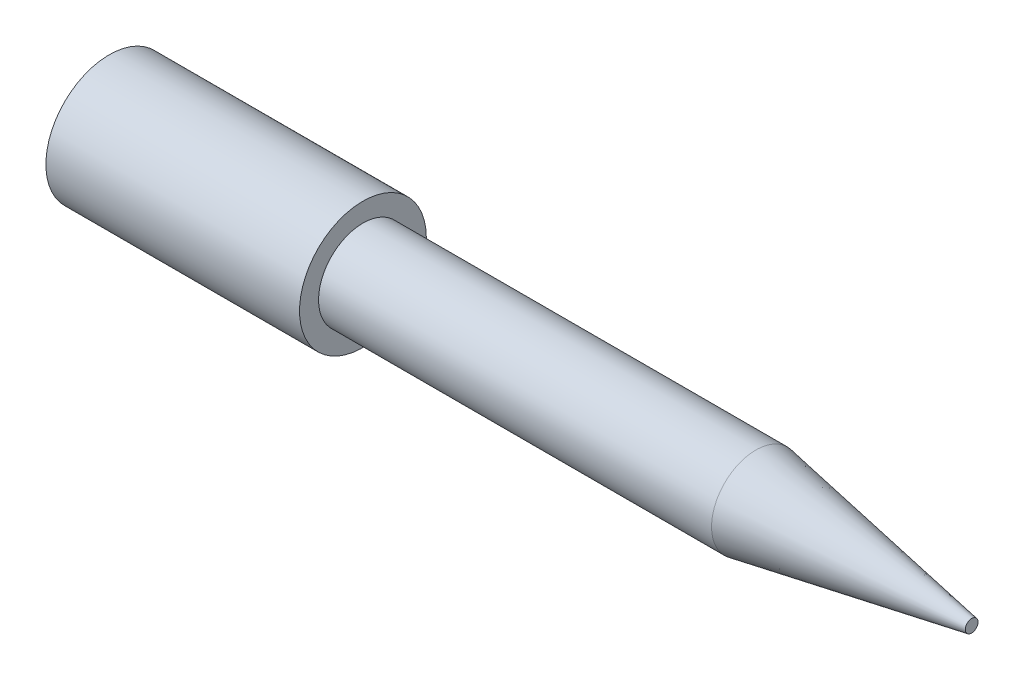
ISO-10303-21;
HEADER;
FILE_DESCRIPTION(('STEP AP214'),'2;1');
FILE_NAME('part.step','',(''),(''),'','','');
FILE_SCHEMA(('AUTOMOTIVE_DESIGN { 1 0 10303 214 1 1 1 1 }'));
ENDSEC;
DATA;
#1=APPLICATION_CONTEXT('core data for automotive mechanical design processes');
#2=APPLICATION_PROTOCOL_DEFINITION('international standard','automotive_design',2000,#1);
#3=PRODUCT_CONTEXT('',#1,'mechanical');
#4=PRODUCT('Part','Part','',(#3));
#5=PRODUCT_RELATED_PRODUCT_CATEGORY('part','',(#4));
#6=PRODUCT_DEFINITION_FORMATION('','',#4);
#7=PRODUCT_DEFINITION_CONTEXT('part definition',#1,'design');
#8=PRODUCT_DEFINITION('design','',#6,#7);
#9=PRODUCT_DEFINITION_SHAPE('','',#8);
#10=(LENGTH_UNIT() NAMED_UNIT(*) SI_UNIT(.MILLI.,.METRE.));
#11=(NAMED_UNIT(*) PLANE_ANGLE_UNIT() SI_UNIT($,.RADIAN.));
#12=(NAMED_UNIT(*) SI_UNIT($,.STERADIAN.) SOLID_ANGLE_UNIT());
#13=UNCERTAINTY_MEASURE_WITH_UNIT(LENGTH_MEASURE(1.E-05),#10,'distance_accuracy_value','');
#14=(GEOMETRIC_REPRESENTATION_CONTEXT(3) GLOBAL_UNCERTAINTY_ASSIGNED_CONTEXT((#13)) GLOBAL_UNIT_ASSIGNED_CONTEXT((#10,
#11,#12)) REPRESENTATION_CONTEXT('',''));
#15=CARTESIAN_POINT('',(0.,0.,0.));
#16=DIRECTION('',(0.,0.,1.));
#17=DIRECTION('',(1.,0.,0.));
#18=AXIS2_PLACEMENT_3D('',#15,#16,#17);
#19=CARTESIAN_POINT('',(10.,0.,0.));
#20=DIRECTION('',(-1.,0.,0.));
#21=DIRECTION('',(0.,0.,1.));
#22=AXIS2_PLACEMENT_3D('',#19,#20,#21);
#23=CYLINDRICAL_SURFACE('',#22,2.5);
#24=CARTESIAN_POINT('',(10.,0.,0.));
#25=DIRECTION('',(1.,0.,0.));
#26=DIRECTION('',(0.,0.,-1.));
#27=AXIS2_PLACEMENT_3D('',#24,#25,#26);
#28=CIRCLE('',#27,2.5);
#29=CARTESIAN_POINT('',(10.,0.,-2.5));
#30=VERTEX_POINT('',#29);
#31=EDGE_CURVE('E51',#30,#30,#28,.T.);
#32=ORIENTED_EDGE('',*,*,#31,.F.);
#33=EDGE_LOOP('',(#32));
#34=FACE_BOUND('',#33,.T.);
#35=CARTESIAN_POINT('',(0.,0.,0.));
#36=DIRECTION('',(1.,0.,0.));
#37=DIRECTION('',(0.,0.,-1.));
#38=AXIS2_PLACEMENT_3D('',#35,#36,#37);
#39=CIRCLE('',#38,2.5);
#40=CARTESIAN_POINT('',(0.,0.,-2.5));
#41=VERTEX_POINT('',#40);
#42=EDGE_CURVE('E54',#41,#41,#39,.T.);
#43=ORIENTED_EDGE('',*,*,#42,.T.);
#44=EDGE_LOOP('',(#43));
#45=FACE_BOUND('',#44,.T.);
#46=ADVANCED_FACE('F35',(#34,#45),#23,.T.);
#47=CARTESIAN_POINT('',(10.,0.,0.));
#48=DIRECTION('',(1.,0.,0.));
#49=DIRECTION('',(0.,0.,-1.));
#50=AXIS2_PLACEMENT_3D('',#47,#48,#49);
#51=PLANE('',#50);
#52=CARTESIAN_POINT('',(10.,0.,0.));
#53=DIRECTION('',(1.,0.,0.));
#54=DIRECTION('',(0.,0.,-1.));
#55=AXIS2_PLACEMENT_3D('',#52,#53,#54);
#56=CIRCLE('',#55,1.75);
#57=CARTESIAN_POINT('',(10.,0.,-1.75));
#58=VERTEX_POINT('',#57);
#59=EDGE_CURVE('E47',#58,#58,#56,.T.);
#60=ORIENTED_EDGE('',*,*,#59,.F.);
#61=EDGE_LOOP('',(#60));
#62=FACE_BOUND('',#61,.T.);
#63=ORIENTED_EDGE('',*,*,#31,.T.);
#64=EDGE_LOOP('',(#63));
#65=FACE_BOUND('',#64,.T.);
#66=ADVANCED_FACE('F60',(#62,#65),#51,.T.);
#67=CARTESIAN_POINT('',(0.,0.,0.));
#68=DIRECTION('',(1.,0.,0.));
#69=DIRECTION('',(0.,0.,-1.));
#70=AXIS2_PLACEMENT_3D('',#67,#68,#69);
#71=PLANE('',#70);
#72=ORIENTED_EDGE('',*,*,#42,.F.);
#73=EDGE_LOOP('',(#72));
#74=FACE_BOUND('',#73,.T.);
#75=ADVANCED_FACE('F66',(#74),#71,.F.);
#76=CARTESIAN_POINT('',(34.,0.,0.));
#77=DIRECTION('',(-1.,0.,0.));
#78=DIRECTION('',(0.,0.,1.));
#79=AXIS2_PLACEMENT_3D('',#76,#77,#78);
#80=CYLINDRICAL_SURFACE('',#79,1.75);
#81=CARTESIAN_POINT('',(25.4930772705736,0.,0.));
#82=DIRECTION('',(1.,0.,0.));
#83=DIRECTION('',(0.,0.,-1.));
#84=AXIS2_PLACEMENT_3D('',#81,#82,#83);
#85=CIRCLE('',#84,1.75);
#86=CARTESIAN_POINT('',(25.4930772705736,0.,1.75));
#87=VERTEX_POINT('',#86);
#88=EDGE_CURVE('E10',#87,#87,#85,.F.);
#89=ORIENTED_EDGE('',*,*,#88,.T.);
#90=EDGE_LOOP('',(#89));
#91=FACE_BOUND('',#90,.T.);
#92=ORIENTED_EDGE('',*,*,#59,.T.);
#93=EDGE_LOOP('',(#92));
#94=FACE_BOUND('',#93,.T.);
#95=ADVANCED_FACE('F68',(#91,#94),#80,.T.);
#96=CARTESIAN_POINT('',(34.,0.,0.));
#97=DIRECTION('',(1.,0.,0.));
#98=DIRECTION('',(0.,0.,-1.));
#99=AXIS2_PLACEMENT_3D('',#96,#97,#98);
#100=PLANE('',#99);
#101=CARTESIAN_POINT('',(34.,0.,0.));
#102=DIRECTION('',(1.,0.,0.));
#103=DIRECTION('',(0.,0.,-1.));
#104=AXIS2_PLACEMENT_3D('',#101,#102,#103);
#105=CIRCLE('',#104,0.250000000000018);
#106=CARTESIAN_POINT('',(34.,0.,0.250000000000019));
#107=VERTEX_POINT('',#106);
#108=EDGE_CURVE('E43',#107,#107,#105,.T.);
#109=ORIENTED_EDGE('',*,*,#108,.T.);
#110=EDGE_LOOP('',(#109));
#111=FACE_BOUND('',#110,.T.);
#112=ADVANCED_FACE('F74',(#111),#100,.T.);
#113=CARTESIAN_POINT('',(34.,0.,0.));
#114=DIRECTION('',(-1.,0.,0.));
#115=DIRECTION('',(0.,0.,1.));
#116=AXIS2_PLACEMENT_3D('',#113,#114,#115);
#117=CONICAL_SURFACE('',#116,0.250000000000018,0.174532925199434);
#118=CARTESIAN_POINT('',(25.4930772705736,0.,1.75));
#119=CARTESIAN_POINT('',(25.5816910490051,0.,1.734375));
#120=CARTESIAN_POINT('',(25.6703048274367,0.,1.71875));
#121=CARTESIAN_POINT('',(25.8475323842997,0.,1.6875));
#122=CARTESIAN_POINT('',(25.9361461627312,0.,1.671875));
#123=CARTESIAN_POINT('',(26.1133737195943,0.,1.640625));
#124=CARTESIAN_POINT('',(26.2019874980258,0.,1.625));
#125=CARTESIAN_POINT('',(26.3792150548889,0.,1.59375));
#126=CARTESIAN_POINT('',(26.4678288333204,0.,1.578125));
#127=CARTESIAN_POINT('',(26.6450563901834,0.,1.546875));
#128=CARTESIAN_POINT('',(26.733670168615,0.,1.53125));
#129=CARTESIAN_POINT('',(26.910897725478,0.,1.5));
#130=CARTESIAN_POINT('',(26.9995115039095,0.,1.484375));
#131=CARTESIAN_POINT('',(27.1767390607726,0.,1.453125));
#132=CARTESIAN_POINT('',(27.2653528392041,0.,1.4375));
#133=CARTESIAN_POINT('',(27.4425803960672,0.,1.40625));
#134=CARTESIAN_POINT('',(27.5311941744987,0.,1.390625));
#135=CARTESIAN_POINT('',(27.7084217313617,0.,1.359375));
#136=CARTESIAN_POINT('',(27.7970355097933,0.,1.34375000000001));
#137=CARTESIAN_POINT('',(27.9742630666563,0.,1.31250000000001));
#138=CARTESIAN_POINT('',(28.0628768450878,0.,1.29687500000001));
#139=CARTESIAN_POINT('',(28.2401044019509,0.,1.26562500000001));
#140=CARTESIAN_POINT('',(28.3287181803824,0.,1.25000000000001));
#141=CARTESIAN_POINT('',(28.5059457372455,0.,1.21875000000001));
#142=CARTESIAN_POINT('',(28.594559515677,0.,1.20312500000001));
#143=CARTESIAN_POINT('',(28.77178707254,0.,1.17187500000001));
#144=CARTESIAN_POINT('',(28.8604008509716,0.,1.15625000000001));
#145=CARTESIAN_POINT('',(29.0376284078346,0.,1.12500000000001));
#146=CARTESIAN_POINT('',(29.1262421862661,0.,1.10937500000001));
#147=CARTESIAN_POINT('',(29.3034697431292,0.,1.07812500000001));
#148=CARTESIAN_POINT('',(29.3920835215607,0.,1.06250000000001));
#149=CARTESIAN_POINT('',(29.5693110784238,0.,1.03125000000001));
#150=CARTESIAN_POINT('',(29.6579248568553,0.,1.01562500000001));
#151=CARTESIAN_POINT('',(29.8351524137183,0.,0.98437500000001));
#152=CARTESIAN_POINT('',(29.9237661921499,0.,0.96875000000001));
#153=CARTESIAN_POINT('',(30.1009937490129,0.,0.93750000000001));
#154=CARTESIAN_POINT('',(30.1896075274444,0.,0.921875000000011));
#155=CARTESIAN_POINT('',(30.3668350843075,0.,0.890625000000011));
#156=CARTESIAN_POINT('',(30.455448862739,0.,0.875000000000011));
#157=CARTESIAN_POINT('',(30.6326764196021,0.,0.843750000000011));
#158=CARTESIAN_POINT('',(30.7212901980336,0.,0.828125000000012));
#159=CARTESIAN_POINT('',(30.8985177548966,0.,0.796875000000012));
#160=CARTESIAN_POINT('',(30.9871315333282,0.,0.781250000000012));
#161=CARTESIAN_POINT('',(31.1643590901912,0.,0.750000000000013));
#162=CARTESIAN_POINT('',(31.2529728686227,0.,0.734375000000013));
#163=CARTESIAN_POINT('',(31.4302004254858,0.,0.703125000000013));
#164=CARTESIAN_POINT('',(31.5188142039173,0.,0.687500000000014));
#165=CARTESIAN_POINT('',(31.6960417607803,0.,0.656250000000014));
#166=CARTESIAN_POINT('',(31.7846555392119,0.,0.640625000000014));
#167=CARTESIAN_POINT('',(31.9618830960749,0.,0.609375000000014));
#168=CARTESIAN_POINT('',(32.0504968745065,0.,0.593750000000015));
#169=CARTESIAN_POINT('',(32.2277244313695,0.,0.562500000000015));
#170=CARTESIAN_POINT('',(32.316338209801,0.,0.546875000000015));
#171=CARTESIAN_POINT('',(32.4935657666641,0.,0.515625000000016));
#172=CARTESIAN_POINT('',(32.5821795450956,0.,0.500000000000016));
#173=CARTESIAN_POINT('',(32.7594071019586,0.,0.468750000000016));
#174=CARTESIAN_POINT('',(32.8480208803902,0.,0.453125000000016));
#175=CARTESIAN_POINT('',(33.0252484372532,0.,0.421875000000017));
#176=CARTESIAN_POINT('',(33.1138622156847,0.,0.406250000000017));
#177=CARTESIAN_POINT('',(33.2910897725478,0.,0.375000000000018));
#178=CARTESIAN_POINT('',(33.3797035509793,0.,0.359375000000018));
#179=CARTESIAN_POINT('',(33.5569311078424,0.,0.328125000000018));
#180=CARTESIAN_POINT('',(33.6455448862739,0.,0.312500000000018));
#181=CARTESIAN_POINT('',(33.822772443137,0.,0.281250000000018));
#182=CARTESIAN_POINT('',(33.9113862215685,0.,0.265625000000019));
#183=CARTESIAN_POINT('',(34.,0.,0.250000000000019));
#184=B_SPLINE_CURVE_WITH_KNOTS('',3,(#118,#119,#120,#121,#122,#123,#124,#125,#126,#127,#128,
#129,#130,#131,#132,#133,#134,#135,#136,#137,#138,#139,#140,#141,#142,#143,#144,#145,#146,#147,
#148,#149,#150,#151,#152,#153,#154,#155,#156,#157,#158,#159,#160,#161,#162,#163,#164,#165,#166,
#167,#168,#169,#170,#171,#172,#173,#174,#175,#176,#177,#178,#179,#180,#181,#182,#183),
.UNSPECIFIED.,.F.,.F.,(4,2,2,2,2,2,2,2,2,2,2,2,2,2,2,2,2,2,2,2,2,2,2,2,2,2,2,2,2,2,2,2,4),(0.,
0.269942366397354,0.539884732794704,0.809827099192058,1.07976946558941,1.34971183198676,
1.61965419838411,1.88959656478147,2.15953893117882,2.42948129757617,2.69942366397352,
2.96936603037087,3.23930839676823,3.50925076316558,3.77919312956293,4.04913549596029,
4.31907786235764,4.58902022875499,4.85896259515234,5.1289049615497,5.39884732794705,
5.6687896943444,5.93873206074175,6.2086744271391,6.47861679353645,6.74855915993381,
7.01850152633116,7.28844389272851,7.55838625912586,7.82832862552322,8.09827099192057,
8.36821335831792,8.63815572471528),.UNSPECIFIED.);
#185=EDGE_CURVE('BSEAM38',#87,#107,#184,.T.);
#186=ORIENTED_EDGE('',*,*,#88,.F.);
#187=ORIENTED_EDGE('',*,*,#108,.F.);
#188=ORIENTED_EDGE('',*,*,#185,.T.);
#189=ORIENTED_EDGE('',*,*,#185,.F.);
#190=EDGE_LOOP('',(#186,#188,#187,#189));
#191=FACE_BOUND('',#190,.T.);
#192=ADVANCED_FACE('F38',(#191),#117,.T.);
#193=CLOSED_SHELL('',(#46,#66,#75,#95,#112,#192));
#194=MANIFOLD_SOLID_BREP('B2',#193);
#195=ADVANCED_BREP_SHAPE_REPRESENTATION('',(#18,#194),#14);
#196=SHAPE_DEFINITION_REPRESENTATION(#9,#195);
ENDSEC;
END-ISO-10303-21;
